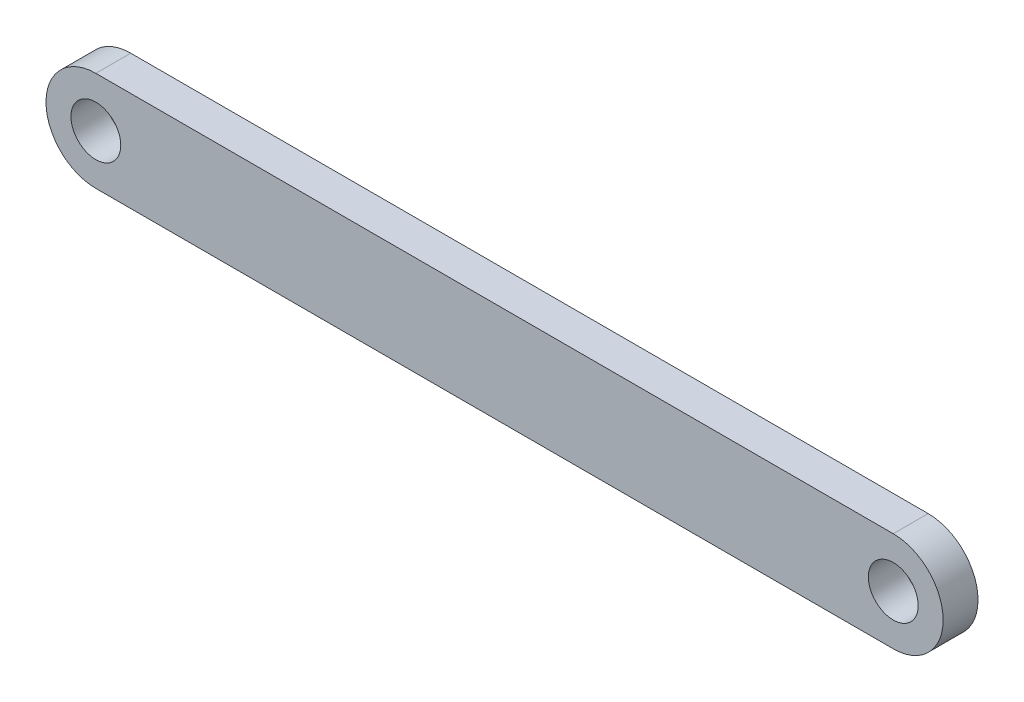
ISO-10303-21;
HEADER;
FILE_DESCRIPTION(('STEP AP214'),'2;1');
FILE_NAME('part.step','',(''),(''),'','','');
FILE_SCHEMA(('AUTOMOTIVE_DESIGN { 1 0 10303 214 1 1 1 1 }'));
ENDSEC;
DATA;
#1=APPLICATION_CONTEXT('core data for automotive mechanical design processes');
#2=APPLICATION_PROTOCOL_DEFINITION('international standard','automotive_design',2000,#1);
#3=PRODUCT_CONTEXT('',#1,'mechanical');
#4=PRODUCT('Part','Part','',(#3));
#5=PRODUCT_RELATED_PRODUCT_CATEGORY('part','',(#4));
#6=PRODUCT_DEFINITION_FORMATION('','',#4);
#7=PRODUCT_DEFINITION_CONTEXT('part definition',#1,'design');
#8=PRODUCT_DEFINITION('design','',#6,#7);
#9=PRODUCT_DEFINITION_SHAPE('','',#8);
#10=(LENGTH_UNIT() NAMED_UNIT(*) SI_UNIT(.MILLI.,.METRE.));
#11=(NAMED_UNIT(*) PLANE_ANGLE_UNIT() SI_UNIT($,.RADIAN.));
#12=(NAMED_UNIT(*) SI_UNIT($,.STERADIAN.) SOLID_ANGLE_UNIT());
#13=UNCERTAINTY_MEASURE_WITH_UNIT(LENGTH_MEASURE(1.E-05),#10,'distance_accuracy_value','');
#14=(GEOMETRIC_REPRESENTATION_CONTEXT(3) GLOBAL_UNCERTAINTY_ASSIGNED_CONTEXT((#13)) GLOBAL_UNIT_ASSIGNED_CONTEXT((#10,
#11,#12)) REPRESENTATION_CONTEXT('',''));
#15=CARTESIAN_POINT('',(0.,0.,0.));
#16=DIRECTION('',(0.,0.,1.));
#17=DIRECTION('',(1.,0.,0.));
#18=AXIS2_PLACEMENT_3D('',#15,#16,#17);
#19=CARTESIAN_POINT('',(0.,0.,7.));
#20=DIRECTION('',(0.,0.,1.));
#21=DIRECTION('',(1.,0.,0.));
#22=AXIS2_PLACEMENT_3D('',#19,#20,#21);
#23=PLANE('',#22);
#24=CARTESIAN_POINT('',(0.,0.,7.));
#25=DIRECTION('',(0.,0.,1.));
#26=DIRECTION('',(1.,0.,0.));
#27=AXIS2_PLACEMENT_3D('',#24,#25,#26);
#28=CIRCLE('',#27,5.);
#29=CARTESIAN_POINT('',(5.,0.,7.));
#30=VERTEX_POINT('',#29);
#31=EDGE_CURVE('E107',#30,#30,#28,.T.);
#32=ORIENTED_EDGE('',*,*,#31,.F.);
#33=EDGE_LOOP('',(#32));
#34=FACE_BOUND('',#33,.T.);
#35=CARTESIAN_POINT('',(0.,0.,7.));
#36=DIRECTION('',(0.,0.,1.));
#37=DIRECTION('',(1.,0.,0.));
#38=AXIS2_PLACEMENT_3D('',#35,#36,#37);
#39=CIRCLE('',#38,10.);
#40=CARTESIAN_POINT('',(0.,10.,7.));
#41=VERTEX_POINT('',#40);
#42=CARTESIAN_POINT('',(0.,-10.,7.));
#43=VERTEX_POINT('',#42);
#44=EDGE_CURVE('E92',#41,#43,#39,.T.);
#45=ORIENTED_EDGE('',*,*,#44,.T.);
#46=DIRECTION('',(1.,0.,0.));
#47=VECTOR('',#46,1.);
#48=CARTESIAN_POINT('',(0.,-10.,7.));
#49=LINE('',#48,#47);
#50=CARTESIAN_POINT('',(160.,-10.,7.));
#51=VERTEX_POINT('',#50);
#52=EDGE_CURVE('E87',#43,#51,#49,.T.);
#53=ORIENTED_EDGE('',*,*,#52,.T.);
#54=CARTESIAN_POINT('',(160.,0.,7.));
#55=DIRECTION('',(0.,0.,1.));
#56=DIRECTION('',(1.,0.,0.));
#57=AXIS2_PLACEMENT_3D('',#54,#55,#56);
#58=CIRCLE('',#57,10.);
#59=CARTESIAN_POINT('',(160.,10.,7.));
#60=VERTEX_POINT('',#59);
#61=EDGE_CURVE('E90',#51,#60,#58,.T.);
#62=ORIENTED_EDGE('',*,*,#61,.T.);
#63=DIRECTION('',(-1.,0.,0.));
#64=VECTOR('',#63,1.);
#65=CARTESIAN_POINT('',(0.,10.,7.));
#66=LINE('',#65,#64);
#67=EDGE_CURVE('E57',#60,#41,#66,.T.);
#68=ORIENTED_EDGE('',*,*,#67,.T.);
#69=EDGE_LOOP('',(#45,#53,#62,#68));
#70=FACE_BOUND('',#69,.T.);
#71=CARTESIAN_POINT('',(160.,0.,7.));
#72=DIRECTION('',(0.,0.,1.));
#73=DIRECTION('',(1.,0.,0.));
#74=AXIS2_PLACEMENT_3D('',#71,#72,#73);
#75=CIRCLE('',#74,4.99999999999999);
#76=CARTESIAN_POINT('',(165.,0.,7.));
#77=VERTEX_POINT('',#76);
#78=EDGE_CURVE('E122',#77,#77,#75,.T.);
#79=ORIENTED_EDGE('',*,*,#78,.F.);
#80=EDGE_LOOP('',(#79));
#81=FACE_BOUND('',#80,.T.);
#82=ADVANCED_FACE('F40',(#34,#70,#81),#23,.T.);
#83=CARTESIAN_POINT('',(0.,0.,0.));
#84=DIRECTION('',(0.,0.,1.));
#85=DIRECTION('',(1.,0.,0.));
#86=AXIS2_PLACEMENT_3D('',#83,#84,#85);
#87=PLANE('',#86);
#88=CARTESIAN_POINT('',(0.,0.,0.));
#89=DIRECTION('',(0.,0.,1.));
#90=DIRECTION('',(1.,0.,0.));
#91=AXIS2_PLACEMENT_3D('',#88,#89,#90);
#92=CIRCLE('',#91,10.);
#93=CARTESIAN_POINT('',(0.,10.,0.));
#94=VERTEX_POINT('',#93);
#95=CARTESIAN_POINT('',(0.,-10.,0.));
#96=VERTEX_POINT('',#95);
#97=EDGE_CURVE('E104',#94,#96,#92,.T.);
#98=ORIENTED_EDGE('',*,*,#97,.F.);
#99=DIRECTION('',(-1.,0.,0.));
#100=VECTOR('',#99,1.);
#101=CARTESIAN_POINT('',(0.,10.,0.));
#102=LINE('',#101,#100);
#103=CARTESIAN_POINT('',(160.,10.,0.));
#104=VERTEX_POINT('',#103);
#105=EDGE_CURVE('E80',#104,#94,#102,.T.);
#106=ORIENTED_EDGE('',*,*,#105,.F.);
#107=CARTESIAN_POINT('',(160.,0.,0.));
#108=DIRECTION('',(0.,0.,1.));
#109=DIRECTION('',(1.,0.,0.));
#110=AXIS2_PLACEMENT_3D('',#107,#108,#109);
#111=CIRCLE('',#110,10.);
#112=CARTESIAN_POINT('',(160.,-10.,0.));
#113=VERTEX_POINT('',#112);
#114=EDGE_CURVE('E74',#113,#104,#111,.T.);
#115=ORIENTED_EDGE('',*,*,#114,.F.);
#116=DIRECTION('',(1.,0.,0.));
#117=VECTOR('',#116,1.);
#118=CARTESIAN_POINT('',(0.,-10.,0.));
#119=LINE('',#118,#117);
#120=EDGE_CURVE('E96',#96,#113,#119,.T.);
#121=ORIENTED_EDGE('',*,*,#120,.F.);
#122=EDGE_LOOP('',(#98,#106,#115,#121));
#123=FACE_BOUND('',#122,.T.);
#124=CARTESIAN_POINT('',(0.,0.,0.));
#125=DIRECTION('',(0.,0.,1.));
#126=DIRECTION('',(1.,0.,0.));
#127=AXIS2_PLACEMENT_3D('',#124,#125,#126);
#128=CIRCLE('',#127,5.);
#129=CARTESIAN_POINT('',(5.,0.,0.));
#130=VERTEX_POINT('',#129);
#131=EDGE_CURVE('E119',#130,#130,#128,.T.);
#132=ORIENTED_EDGE('',*,*,#131,.T.);
#133=EDGE_LOOP('',(#132));
#134=FACE_BOUND('',#133,.T.);
#135=CARTESIAN_POINT('',(160.,0.,0.));
#136=DIRECTION('',(0.,0.,1.));
#137=DIRECTION('',(1.,0.,0.));
#138=AXIS2_PLACEMENT_3D('',#135,#136,#137);
#139=CIRCLE('',#138,4.99999999999999);
#140=CARTESIAN_POINT('',(165.,0.,0.));
#141=VERTEX_POINT('',#140);
#142=EDGE_CURVE('E125',#141,#141,#139,.T.);
#143=ORIENTED_EDGE('',*,*,#142,.T.);
#144=EDGE_LOOP('',(#143));
#145=FACE_BOUND('',#144,.T.);
#146=ADVANCED_FACE('F115',(#123,#134,#145),#87,.F.);
#147=CARTESIAN_POINT('',(0.,0.,7.));
#148=DIRECTION('',(0.,0.,-1.));
#149=DIRECTION('',(-1.,0.,0.));
#150=AXIS2_PLACEMENT_3D('',#147,#148,#149);
#151=CYLINDRICAL_SURFACE('',#150,10.);
#152=ORIENTED_EDGE('',*,*,#97,.T.);
#153=DIRECTION('',(0.,0.,-1.));
#154=VECTOR('',#153,1.);
#155=CARTESIAN_POINT('',(0.,-10.,7.));
#156=LINE('',#155,#154);
#157=EDGE_CURVE('E11',#43,#96,#156,.T.);
#158=ORIENTED_EDGE('',*,*,#157,.F.);
#159=ORIENTED_EDGE('',*,*,#44,.F.);
#160=DIRECTION('',(0.,0.,-1.));
#161=VECTOR('',#160,1.);
#162=CARTESIAN_POINT('',(0.,10.,7.));
#163=LINE('',#162,#161);
#164=EDGE_CURVE('E100',#41,#94,#163,.T.);
#165=ORIENTED_EDGE('',*,*,#164,.T.);
#166=EDGE_LOOP('',(#152,#158,#159,#165));
#167=FACE_BOUND('',#166,.T.);
#168=ADVANCED_FACE('F42',(#167),#151,.T.);
#169=CARTESIAN_POINT('',(0.,-10.,7.));
#170=DIRECTION('',(0.,1.,0.));
#171=DIRECTION('',(-1.,0.,0.));
#172=AXIS2_PLACEMENT_3D('',#169,#170,#171);
#173=PLANE('',#172);
#174=ORIENTED_EDGE('',*,*,#120,.T.);
#175=DIRECTION('',(0.,0.,-1.));
#176=VECTOR('',#175,1.);
#177=CARTESIAN_POINT('',(160.,-10.,7.));
#178=LINE('',#177,#176);
#179=EDGE_CURVE('E49',#51,#113,#178,.T.);
#180=ORIENTED_EDGE('',*,*,#179,.F.);
#181=ORIENTED_EDGE('',*,*,#52,.F.);
#182=ORIENTED_EDGE('',*,*,#157,.T.);
#183=EDGE_LOOP('',(#174,#180,#181,#182));
#184=FACE_BOUND('',#183,.T.);
#185=ADVANCED_FACE('F95',(#184),#173,.F.);
#186=CARTESIAN_POINT('',(160.,0.,7.));
#187=DIRECTION('',(0.,0.,-1.));
#188=DIRECTION('',(-1.,0.,0.));
#189=AXIS2_PLACEMENT_3D('',#186,#187,#188);
#190=CYLINDRICAL_SURFACE('',#189,10.);
#191=ORIENTED_EDGE('',*,*,#114,.T.);
#192=DIRECTION('',(0.,0.,-1.));
#193=VECTOR('',#192,1.);
#194=CARTESIAN_POINT('',(160.,10.,7.));
#195=LINE('',#194,#193);
#196=EDGE_CURVE('E97',#60,#104,#195,.T.);
#197=ORIENTED_EDGE('',*,*,#196,.F.);
#198=ORIENTED_EDGE('',*,*,#61,.F.);
#199=ORIENTED_EDGE('',*,*,#179,.T.);
#200=EDGE_LOOP('',(#191,#197,#198,#199));
#201=FACE_BOUND('',#200,.T.);
#202=ADVANCED_FACE('F98',(#201),#190,.T.);
#203=CARTESIAN_POINT('',(0.,10.,7.));
#204=DIRECTION('',(0.,-1.,0.));
#205=DIRECTION('',(1.,0.,0.));
#206=AXIS2_PLACEMENT_3D('',#203,#204,#205);
#207=PLANE('',#206);
#208=ORIENTED_EDGE('',*,*,#105,.T.);
#209=ORIENTED_EDGE('',*,*,#164,.F.);
#210=ORIENTED_EDGE('',*,*,#67,.F.);
#211=ORIENTED_EDGE('',*,*,#196,.T.);
#212=EDGE_LOOP('',(#208,#209,#210,#211));
#213=FACE_BOUND('',#212,.T.);
#214=ADVANCED_FACE('F112',(#213),#207,.F.);
#215=CARTESIAN_POINT('',(0.,0.,7.));
#216=DIRECTION('',(0.,0.,-1.));
#217=DIRECTION('',(-1.,0.,0.));
#218=AXIS2_PLACEMENT_3D('',#215,#216,#217);
#219=CYLINDRICAL_SURFACE('',#218,5.);
#220=ORIENTED_EDGE('',*,*,#31,.T.);
#221=EDGE_LOOP('',(#220));
#222=FACE_BOUND('',#221,.T.);
#223=ORIENTED_EDGE('',*,*,#131,.F.);
#224=EDGE_LOOP('',(#223));
#225=FACE_BOUND('',#224,.T.);
#226=ADVANCED_FACE('F142',(#222,#225),#219,.F.);
#227=CARTESIAN_POINT('',(160.,0.,7.));
#228=DIRECTION('',(0.,0.,-1.));
#229=DIRECTION('',(-1.,0.,0.));
#230=AXIS2_PLACEMENT_3D('',#227,#228,#229);
#231=CYLINDRICAL_SURFACE('',#230,4.99999999999999);
#232=ORIENTED_EDGE('',*,*,#78,.T.);
#233=EDGE_LOOP('',(#232));
#234=FACE_BOUND('',#233,.T.);
#235=ORIENTED_EDGE('',*,*,#142,.F.);
#236=EDGE_LOOP('',(#235));
#237=FACE_BOUND('',#236,.T.);
#238=ADVANCED_FACE('F131',(#234,#237),#231,.F.);
#239=CLOSED_SHELL('',(#82,#146,#168,#185,#202,#214,#226,#238));
#240=MANIFOLD_SOLID_BREP('B2',#239);
#241=ADVANCED_BREP_SHAPE_REPRESENTATION('',(#18,#240),#14);
#242=SHAPE_DEFINITION_REPRESENTATION(#9,#241);
ENDSEC;
END-ISO-10303-21;
